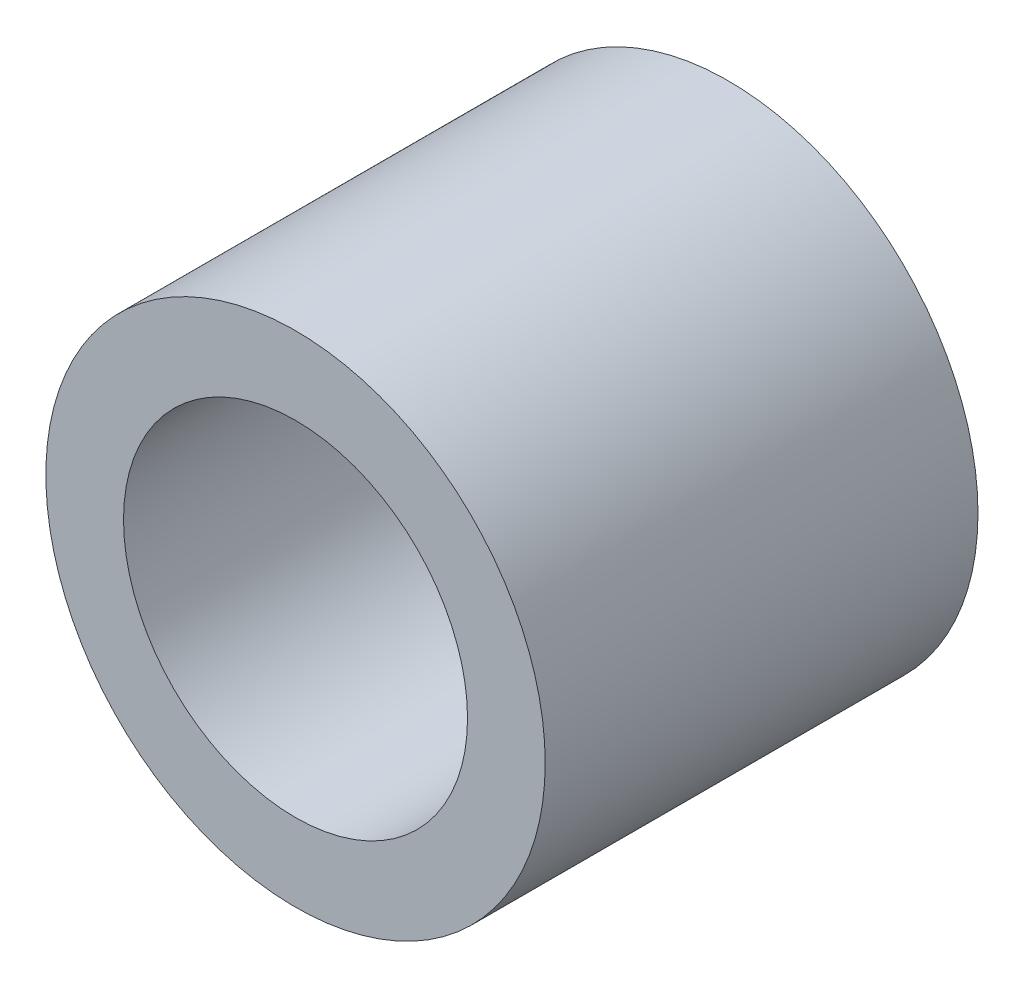
ISO-10303-21;
HEADER;
FILE_DESCRIPTION(('STEP AP214'),'2;1');
FILE_NAME('part.step','',(''),(''),'','','');
FILE_SCHEMA(('AUTOMOTIVE_DESIGN { 1 0 10303 214 1 1 1 1 }'));
ENDSEC;
DATA;
#1=APPLICATION_CONTEXT('core data for automotive mechanical design processes');
#2=APPLICATION_PROTOCOL_DEFINITION('international standard','automotive_design',2000,#1);
#3=PRODUCT_CONTEXT('',#1,'mechanical');
#4=PRODUCT('Part','Part','',(#3));
#5=PRODUCT_RELATED_PRODUCT_CATEGORY('part','',(#4));
#6=PRODUCT_DEFINITION_FORMATION('','',#4);
#7=PRODUCT_DEFINITION_CONTEXT('part definition',#1,'design');
#8=PRODUCT_DEFINITION('design','',#6,#7);
#9=PRODUCT_DEFINITION_SHAPE('','',#8);
#10=(LENGTH_UNIT() NAMED_UNIT(*) SI_UNIT(.MILLI.,.METRE.));
#11=(NAMED_UNIT(*) PLANE_ANGLE_UNIT() SI_UNIT($,.RADIAN.));
#12=(NAMED_UNIT(*) SI_UNIT($,.STERADIAN.) SOLID_ANGLE_UNIT());
#13=UNCERTAINTY_MEASURE_WITH_UNIT(LENGTH_MEASURE(1.E-05),#10,'distance_accuracy_value','');
#14=(GEOMETRIC_REPRESENTATION_CONTEXT(3) GLOBAL_UNCERTAINTY_ASSIGNED_CONTEXT((#13)) GLOBAL_UNIT_ASSIGNED_CONTEXT((#10,
#11,#12)) REPRESENTATION_CONTEXT('',''));
#15=CARTESIAN_POINT('',(0.,0.,0.));
#16=DIRECTION('',(0.,0.,1.));
#17=DIRECTION('',(1.,0.,0.));
#18=AXIS2_PLACEMENT_3D('',#15,#16,#17);
#19=CARTESIAN_POINT('',(-36.,-62.,14.));
#20=DIRECTION('',(0.,0.,1.));
#21=DIRECTION('',(1.,0.,0.));
#22=AXIS2_PLACEMENT_3D('',#19,#20,#21);
#23=PLANE('',#22);
#24=CARTESIAN_POINT('',(-36.,-62.,14.));
#25=DIRECTION('',(0.,0.,1.));
#26=DIRECTION('',(1.,0.,0.));
#27=AXIS2_PLACEMENT_3D('',#24,#25,#26);
#28=CIRCLE('',#27,4.5);
#29=CARTESIAN_POINT('',(-31.5,-62.,14.));
#30=VERTEX_POINT('',#29);
#31=EDGE_CURVE('E10',#30,#30,#28,.T.);
#32=ORIENTED_EDGE('',*,*,#31,.T.);
#33=EDGE_LOOP('',(#32));
#34=FACE_BOUND('',#33,.T.);
#35=CARTESIAN_POINT('',(-36.,-62.,14.));
#36=DIRECTION('',(0.,0.,1.));
#37=DIRECTION('',(1.,0.,0.));
#38=AXIS2_PLACEMENT_3D('',#35,#36,#37);
#39=CIRCLE('',#38,3.1);
#40=CARTESIAN_POINT('',(-32.9,-62.,14.));
#41=VERTEX_POINT('',#40);
#42=EDGE_CURVE('E42',#41,#41,#39,.T.);
#43=ORIENTED_EDGE('',*,*,#42,.F.);
#44=EDGE_LOOP('',(#43));
#45=FACE_BOUND('',#44,.T.);
#46=ADVANCED_FACE('F31',(#34,#45),#23,.T.);
#47=CARTESIAN_POINT('',(-36.,-62.,6.2));
#48=DIRECTION('',(0.,0.,1.));
#49=DIRECTION('',(1.,0.,0.));
#50=AXIS2_PLACEMENT_3D('',#47,#48,#49);
#51=PLANE('',#50);
#52=CARTESIAN_POINT('',(-36.,-62.,6.2));
#53=DIRECTION('',(0.,0.,1.));
#54=DIRECTION('',(1.,0.,0.));
#55=AXIS2_PLACEMENT_3D('',#52,#53,#54);
#56=CIRCLE('',#55,4.5);
#57=CARTESIAN_POINT('',(-31.5,-62.,6.2));
#58=VERTEX_POINT('',#57);
#59=EDGE_CURVE('E35',#58,#58,#56,.T.);
#60=ORIENTED_EDGE('',*,*,#59,.F.);
#61=EDGE_LOOP('',(#60));
#62=FACE_BOUND('',#61,.T.);
#63=CARTESIAN_POINT('',(-36.,-62.,6.2));
#64=DIRECTION('',(0.,0.,1.));
#65=DIRECTION('',(1.,0.,0.));
#66=AXIS2_PLACEMENT_3D('',#63,#64,#65);
#67=CIRCLE('',#66,3.1);
#68=CARTESIAN_POINT('',(-32.9,-62.,6.2));
#69=VERTEX_POINT('',#68);
#70=EDGE_CURVE('E44',#69,#69,#67,.T.);
#71=ORIENTED_EDGE('',*,*,#70,.T.);
#72=EDGE_LOOP('',(#71));
#73=FACE_BOUND('',#72,.T.);
#74=ADVANCED_FACE('F54',(#62,#73),#51,.F.);
#75=CARTESIAN_POINT('',(-36.,-62.,14.));
#76=DIRECTION('',(0.,0.,-1.));
#77=DIRECTION('',(-1.,0.,0.));
#78=AXIS2_PLACEMENT_3D('',#75,#76,#77);
#79=CYLINDRICAL_SURFACE('',#78,4.5);
#80=ORIENTED_EDGE('',*,*,#31,.F.);
#81=EDGE_LOOP('',(#80));
#82=FACE_BOUND('',#81,.T.);
#83=ORIENTED_EDGE('',*,*,#59,.T.);
#84=EDGE_LOOP('',(#83));
#85=FACE_BOUND('',#84,.T.);
#86=ADVANCED_FACE('F33',(#82,#85),#79,.T.);
#87=CARTESIAN_POINT('',(-36.,-62.,14.));
#88=DIRECTION('',(0.,0.,-1.));
#89=DIRECTION('',(-1.,0.,0.));
#90=AXIS2_PLACEMENT_3D('',#87,#88,#89);
#91=CYLINDRICAL_SURFACE('',#90,3.1);
#92=ORIENTED_EDGE('',*,*,#42,.T.);
#93=EDGE_LOOP('',(#92));
#94=FACE_BOUND('',#93,.T.);
#95=ORIENTED_EDGE('',*,*,#70,.F.);
#96=EDGE_LOOP('',(#95));
#97=FACE_BOUND('',#96,.T.);
#98=ADVANCED_FACE('F50',(#94,#97),#91,.F.);
#99=CLOSED_SHELL('',(#46,#74,#86,#98));
#100=MANIFOLD_SOLID_BREP('B2',#99);
#101=ADVANCED_BREP_SHAPE_REPRESENTATION('',(#18,#100),#14);
#102=SHAPE_DEFINITION_REPRESENTATION(#9,#101);
ENDSEC;
END-ISO-10303-21;
